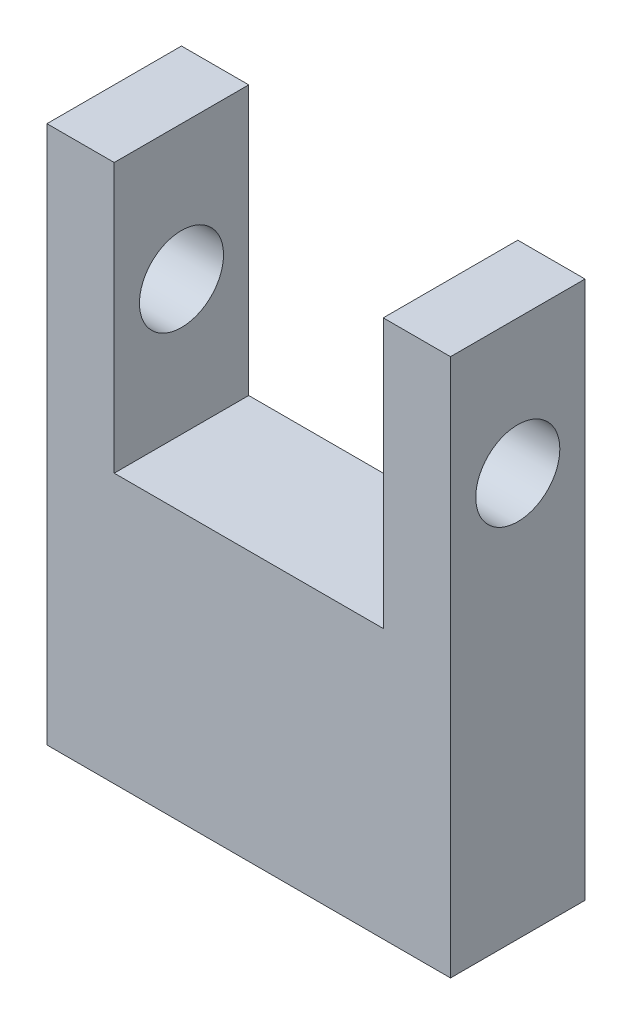
ISO-10303-21;
HEADER;
FILE_DESCRIPTION(('STEP AP214'),'2;1');
FILE_NAME('part.step','',(''),(''),'','','');
FILE_SCHEMA(('AUTOMOTIVE_DESIGN { 1 0 10303 214 1 1 1 1 }'));
ENDSEC;
DATA;
#1=APPLICATION_CONTEXT('core data for automotive mechanical design processes');
#2=APPLICATION_PROTOCOL_DEFINITION('international standard','automotive_design',2000,#1);
#3=PRODUCT_CONTEXT('',#1,'mechanical');
#4=PRODUCT('Part','Part','',(#3));
#5=PRODUCT_RELATED_PRODUCT_CATEGORY('part','',(#4));
#6=PRODUCT_DEFINITION_FORMATION('','',#4);
#7=PRODUCT_DEFINITION_CONTEXT('part definition',#1,'design');
#8=PRODUCT_DEFINITION('design','',#6,#7);
#9=PRODUCT_DEFINITION_SHAPE('','',#8);
#10=(LENGTH_UNIT() NAMED_UNIT(*) SI_UNIT(.MILLI.,.METRE.));
#11=(NAMED_UNIT(*) PLANE_ANGLE_UNIT() SI_UNIT($,.RADIAN.));
#12=(NAMED_UNIT(*) SI_UNIT($,.STERADIAN.) SOLID_ANGLE_UNIT());
#13=UNCERTAINTY_MEASURE_WITH_UNIT(LENGTH_MEASURE(1.E-05),#10,'distance_accuracy_value','');
#14=(GEOMETRIC_REPRESENTATION_CONTEXT(3) GLOBAL_UNCERTAINTY_ASSIGNED_CONTEXT((#13)) GLOBAL_UNIT_ASSIGNED_CONTEXT((#10,
#11,#12)) REPRESENTATION_CONTEXT('',''));
#15=CARTESIAN_POINT('',(0.,0.,0.));
#16=DIRECTION('',(0.,0.,1.));
#17=DIRECTION('',(1.,0.,0.));
#18=AXIS2_PLACEMENT_3D('',#15,#16,#17);
#19=CARTESIAN_POINT('',(38.1,0.,12.7));
#20=DIRECTION('',(-1.,0.,0.));
#21=DIRECTION('',(0.,-1.,0.));
#22=AXIS2_PLACEMENT_3D('',#19,#20,#21);
#23=PLANE('',#22);
#24=CARTESIAN_POINT('',(38.1,76.2,0.));
#25=DIRECTION('',(1.,0.,0.));
#26=DIRECTION('',(0.,0.,-1.));
#27=AXIS2_PLACEMENT_3D('',#24,#25,#26);
#28=CIRCLE('',#27,7.9375);
#29=CARTESIAN_POINT('',(38.1,76.2,-7.9375));
#30=VERTEX_POINT('',#29);
#31=EDGE_CURVE('E185',#30,#30,#28,.T.);
#32=ORIENTED_EDGE('',*,*,#31,.F.);
#33=EDGE_LOOP('',(#32));
#34=FACE_BOUND('',#33,.T.);
#35=DIRECTION('',(0.,1.,0.));
#36=VECTOR('',#35,1.);
#37=CARTESIAN_POINT('',(38.1,0.,-12.7));
#38=LINE('',#37,#36);
#39=CARTESIAN_POINT('',(38.1,0.,-12.7));
#40=VERTEX_POINT('',#39);
#41=CARTESIAN_POINT('',(38.1,101.6,-12.7));
#42=VERTEX_POINT('',#41);
#43=EDGE_CURVE('E129',#40,#42,#38,.T.);
#44=ORIENTED_EDGE('',*,*,#43,.T.);
#45=DIRECTION('',(0.,0.,-1.));
#46=VECTOR('',#45,1.);
#47=CARTESIAN_POINT('',(38.1,101.6,12.7));
#48=LINE('',#47,#46);
#49=CARTESIAN_POINT('',(38.1,101.6,12.7));
#50=VERTEX_POINT('',#49);
#51=EDGE_CURVE('E11',#50,#42,#48,.T.);
#52=ORIENTED_EDGE('',*,*,#51,.F.);
#53=DIRECTION('',(0.,1.,0.));
#54=VECTOR('',#53,1.);
#55=CARTESIAN_POINT('',(38.1,0.,12.7));
#56=LINE('',#55,#54);
#57=CARTESIAN_POINT('',(38.1,0.,12.7));
#58=VERTEX_POINT('',#57);
#59=EDGE_CURVE('E144',#58,#50,#56,.T.);
#60=ORIENTED_EDGE('',*,*,#59,.F.);
#61=DIRECTION('',(0.,0.,-1.));
#62=VECTOR('',#61,1.);
#63=CARTESIAN_POINT('',(38.1,0.,12.7));
#64=LINE('',#63,#62);
#65=EDGE_CURVE('E125',#58,#40,#64,.T.);
#66=ORIENTED_EDGE('',*,*,#65,.T.);
#67=EDGE_LOOP('',(#44,#52,#60,#66));
#68=FACE_BOUND('',#67,.T.);
#69=ADVANCED_FACE('F33',(#34,#68),#23,.F.);
#70=CARTESIAN_POINT('',(38.1,101.6,12.7));
#71=DIRECTION('',(0.,-1.,0.));
#72=DIRECTION('',(1.,0.,0.));
#73=AXIS2_PLACEMENT_3D('',#70,#71,#72);
#74=PLANE('',#73);
#75=DIRECTION('',(-1.,0.,0.));
#76=VECTOR('',#75,1.);
#77=CARTESIAN_POINT('',(38.1,101.6,-12.7));
#78=LINE('',#77,#76);
#79=CARTESIAN_POINT('',(25.4,101.6,-12.7));
#80=VERTEX_POINT('',#79);
#81=EDGE_CURVE('E132',#42,#80,#78,.T.);
#82=ORIENTED_EDGE('',*,*,#81,.T.);
#83=DIRECTION('',(0.,0.,-1.));
#84=VECTOR('',#83,1.);
#85=CARTESIAN_POINT('',(25.4,101.6,12.7));
#86=LINE('',#85,#84);
#87=CARTESIAN_POINT('',(25.4,101.6,12.7));
#88=VERTEX_POINT('',#87);
#89=EDGE_CURVE('E41',#88,#80,#86,.T.);
#90=ORIENTED_EDGE('',*,*,#89,.F.);
#91=DIRECTION('',(-1.,0.,0.));
#92=VECTOR('',#91,1.);
#93=CARTESIAN_POINT('',(38.1,101.6,12.7));
#94=LINE('',#93,#92);
#95=EDGE_CURVE('E92',#50,#88,#94,.T.);
#96=ORIENTED_EDGE('',*,*,#95,.F.);
#97=ORIENTED_EDGE('',*,*,#51,.T.);
#98=EDGE_LOOP('',(#82,#90,#96,#97));
#99=FACE_BOUND('',#98,.T.);
#100=ADVANCED_FACE('F194',(#99),#74,.F.);
#101=CARTESIAN_POINT('',(25.4,101.6,12.7));
#102=DIRECTION('',(1.,0.,0.));
#103=DIRECTION('',(0.,0.,-1.));
#104=AXIS2_PLACEMENT_3D('',#101,#102,#103);
#105=PLANE('',#104);
#106=CARTESIAN_POINT('',(25.4,76.2,0.));
#107=DIRECTION('',(1.,0.,0.));
#108=DIRECTION('',(0.,0.,-1.));
#109=AXIS2_PLACEMENT_3D('',#106,#107,#108);
#110=CIRCLE('',#109,7.9375);
#111=CARTESIAN_POINT('',(25.4,76.2,-7.9375));
#112=VERTEX_POINT('',#111);
#113=EDGE_CURVE('E133',#112,#112,#110,.T.);
#114=ORIENTED_EDGE('',*,*,#113,.T.);
#115=EDGE_LOOP('',(#114));
#116=FACE_BOUND('',#115,.T.);
#117=DIRECTION('',(0.,-1.,0.));
#118=VECTOR('',#117,1.);
#119=CARTESIAN_POINT('',(25.4,101.6,-12.7));
#120=LINE('',#119,#118);
#121=CARTESIAN_POINT('',(25.4,50.8,-12.7));
#122=VERTEX_POINT('',#121);
#123=EDGE_CURVE('E135',#80,#122,#120,.T.);
#124=ORIENTED_EDGE('',*,*,#123,.T.);
#125=DIRECTION('',(0.,0.,-1.));
#126=VECTOR('',#125,1.);
#127=CARTESIAN_POINT('',(25.4,50.8,12.7));
#128=LINE('',#127,#126);
#129=CARTESIAN_POINT('',(25.4,50.8,12.7));
#130=VERTEX_POINT('',#129);
#131=EDGE_CURVE('E151',#130,#122,#128,.T.);
#132=ORIENTED_EDGE('',*,*,#131,.F.);
#133=DIRECTION('',(0.,-1.,0.));
#134=VECTOR('',#133,1.);
#135=CARTESIAN_POINT('',(25.4,101.6,12.7));
#136=LINE('',#135,#134);
#137=EDGE_CURVE('E159',#88,#130,#136,.T.);
#138=ORIENTED_EDGE('',*,*,#137,.F.);
#139=ORIENTED_EDGE('',*,*,#89,.T.);
#140=EDGE_LOOP('',(#124,#132,#138,#139));
#141=FACE_BOUND('',#140,.T.);
#142=ADVANCED_FACE('F157',(#116,#141),#105,.F.);
#143=CARTESIAN_POINT('',(25.4,50.8,12.7));
#144=DIRECTION('',(0.,-1.,0.));
#145=DIRECTION('',(1.,0.,0.));
#146=AXIS2_PLACEMENT_3D('',#143,#144,#145);
#147=PLANE('',#146);
#148=DIRECTION('',(-1.,0.,0.));
#149=VECTOR('',#148,1.);
#150=CARTESIAN_POINT('',(25.4,50.8,-12.7));
#151=LINE('',#150,#149);
#152=CARTESIAN_POINT('',(-25.4,50.8,-12.7));
#153=VERTEX_POINT('',#152);
#154=EDGE_CURVE('E137',#122,#153,#151,.T.);
#155=ORIENTED_EDGE('',*,*,#154,.T.);
#156=DIRECTION('',(0.,0.,-1.));
#157=VECTOR('',#156,1.);
#158=CARTESIAN_POINT('',(-25.4,50.8,12.7));
#159=LINE('',#158,#157);
#160=CARTESIAN_POINT('',(-25.4,50.8,12.7));
#161=VERTEX_POINT('',#160);
#162=EDGE_CURVE('E148',#161,#153,#159,.T.);
#163=ORIENTED_EDGE('',*,*,#162,.F.);
#164=DIRECTION('',(-1.,0.,0.));
#165=VECTOR('',#164,1.);
#166=CARTESIAN_POINT('',(25.4,50.8,12.7));
#167=LINE('',#166,#165);
#168=EDGE_CURVE('E171',#130,#161,#167,.T.);
#169=ORIENTED_EDGE('',*,*,#168,.F.);
#170=ORIENTED_EDGE('',*,*,#131,.T.);
#171=EDGE_LOOP('',(#155,#163,#169,#170));
#172=FACE_BOUND('',#171,.T.);
#173=ADVANCED_FACE('F167',(#172),#147,.F.);
#174=CARTESIAN_POINT('',(-25.4,101.6,12.7));
#175=DIRECTION('',(-1.,0.,0.));
#176=DIRECTION('',(0.,-1.,0.));
#177=AXIS2_PLACEMENT_3D('',#174,#175,#176);
#178=PLANE('',#177);
#179=CARTESIAN_POINT('',(-25.4,76.2,0.));
#180=DIRECTION('',(-1.,0.,0.));
#181=DIRECTION('',(0.,-1.,0.));
#182=AXIS2_PLACEMENT_3D('',#179,#180,#181);
#183=CIRCLE('',#182,7.9375);
#184=CARTESIAN_POINT('',(-25.4,68.2625,0.));
#185=VERTEX_POINT('',#184);
#186=EDGE_CURVE('E179',#185,#185,#183,.T.);
#187=ORIENTED_EDGE('',*,*,#186,.T.);
#188=EDGE_LOOP('',(#187));
#189=FACE_BOUND('',#188,.T.);
#190=DIRECTION('',(0.,1.,0.));
#191=VECTOR('',#190,1.);
#192=CARTESIAN_POINT('',(-25.4,101.6,-12.7));
#193=LINE('',#192,#191);
#194=CARTESIAN_POINT('',(-25.4,101.6,-12.7));
#195=VERTEX_POINT('',#194);
#196=EDGE_CURVE('E139',#153,#195,#193,.T.);
#197=ORIENTED_EDGE('',*,*,#196,.T.);
#198=DIRECTION('',(0.,0.,-1.));
#199=VECTOR('',#198,1.);
#200=CARTESIAN_POINT('',(-25.4,101.6,12.7));
#201=LINE('',#200,#199);
#202=CARTESIAN_POINT('',(-25.4,101.6,12.7));
#203=VERTEX_POINT('',#202);
#204=EDGE_CURVE('E120',#203,#195,#201,.T.);
#205=ORIENTED_EDGE('',*,*,#204,.F.);
#206=DIRECTION('',(0.,1.,0.));
#207=VECTOR('',#206,1.);
#208=CARTESIAN_POINT('',(-25.4,101.6,12.7));
#209=LINE('',#208,#207);
#210=EDGE_CURVE('E111',#161,#203,#209,.T.);
#211=ORIENTED_EDGE('',*,*,#210,.F.);
#212=ORIENTED_EDGE('',*,*,#162,.T.);
#213=EDGE_LOOP('',(#197,#205,#211,#212));
#214=FACE_BOUND('',#213,.T.);
#215=ADVANCED_FACE('F170',(#189,#214),#178,.F.);
#216=CARTESIAN_POINT('',(-38.1,101.6,12.7));
#217=DIRECTION('',(0.,-1.,0.));
#218=DIRECTION('',(1.,0.,0.));
#219=AXIS2_PLACEMENT_3D('',#216,#217,#218);
#220=PLANE('',#219);
#221=DIRECTION('',(-1.,0.,0.));
#222=VECTOR('',#221,1.);
#223=CARTESIAN_POINT('',(-38.1,101.6,-12.7));
#224=LINE('',#223,#222);
#225=CARTESIAN_POINT('',(-38.1,101.6,-12.7));
#226=VERTEX_POINT('',#225);
#227=EDGE_CURVE('E119',#195,#226,#224,.T.);
#228=ORIENTED_EDGE('',*,*,#227,.T.);
#229=DIRECTION('',(0.,0.,-1.));
#230=VECTOR('',#229,1.);
#231=CARTESIAN_POINT('',(-38.1,101.6,12.7));
#232=LINE('',#231,#230);
#233=CARTESIAN_POINT('',(-38.1,101.6,12.7));
#234=VERTEX_POINT('',#233);
#235=EDGE_CURVE('E116',#234,#226,#232,.T.);
#236=ORIENTED_EDGE('',*,*,#235,.F.);
#237=DIRECTION('',(-1.,0.,0.));
#238=VECTOR('',#237,1.);
#239=CARTESIAN_POINT('',(-38.1,101.6,12.7));
#240=LINE('',#239,#238);
#241=EDGE_CURVE('E105',#203,#234,#240,.T.);
#242=ORIENTED_EDGE('',*,*,#241,.F.);
#243=ORIENTED_EDGE('',*,*,#204,.T.);
#244=EDGE_LOOP('',(#228,#236,#242,#243));
#245=FACE_BOUND('',#244,.T.);
#246=ADVANCED_FACE('F117',(#245),#220,.F.);
#247=CARTESIAN_POINT('',(-38.1,0.,12.7));
#248=DIRECTION('',(1.,0.,0.));
#249=DIRECTION('',(0.,1.,0.));
#250=AXIS2_PLACEMENT_3D('',#247,#248,#249);
#251=PLANE('',#250);
#252=CARTESIAN_POINT('',(-38.1,76.2,0.));
#253=DIRECTION('',(1.,0.,0.));
#254=DIRECTION('',(0.,0.,-1.));
#255=AXIS2_PLACEMENT_3D('',#252,#253,#254);
#256=CIRCLE('',#255,7.9375);
#257=CARTESIAN_POINT('',(-38.1,76.2,-7.9375));
#258=VERTEX_POINT('',#257);
#259=EDGE_CURVE('E182',#258,#258,#256,.T.);
#260=ORIENTED_EDGE('',*,*,#259,.T.);
#261=EDGE_LOOP('',(#260));
#262=FACE_BOUND('',#261,.T.);
#263=DIRECTION('',(0.,-1.,0.));
#264=VECTOR('',#263,1.);
#265=CARTESIAN_POINT('',(-38.1,0.,-12.7));
#266=LINE('',#265,#264);
#267=CARTESIAN_POINT('',(-38.1,0.,-12.7));
#268=VERTEX_POINT('',#267);
#269=EDGE_CURVE('E78',#226,#268,#266,.T.);
#270=ORIENTED_EDGE('',*,*,#269,.T.);
#271=DIRECTION('',(0.,0.,-1.));
#272=VECTOR('',#271,1.);
#273=CARTESIAN_POINT('',(-38.1,0.,12.7));
#274=LINE('',#273,#272);
#275=CARTESIAN_POINT('',(-38.1,0.,12.7));
#276=VERTEX_POINT('',#275);
#277=EDGE_CURVE('E121',#276,#268,#274,.T.);
#278=ORIENTED_EDGE('',*,*,#277,.F.);
#279=DIRECTION('',(0.,-1.,0.));
#280=VECTOR('',#279,1.);
#281=CARTESIAN_POINT('',(-38.1,0.,12.7));
#282=LINE('',#281,#280);
#283=EDGE_CURVE('E109',#234,#276,#282,.T.);
#284=ORIENTED_EDGE('',*,*,#283,.F.);
#285=ORIENTED_EDGE('',*,*,#235,.T.);
#286=EDGE_LOOP('',(#270,#278,#284,#285));
#287=FACE_BOUND('',#286,.T.);
#288=ADVANCED_FACE('F123',(#262,#287),#251,.F.);
#289=CARTESIAN_POINT('',(-38.1,0.,12.7));
#290=DIRECTION('',(0.,1.,0.));
#291=DIRECTION('',(-1.,0.,0.));
#292=AXIS2_PLACEMENT_3D('',#289,#290,#291);
#293=PLANE('',#292);
#294=DIRECTION('',(1.,0.,0.));
#295=VECTOR('',#294,1.);
#296=CARTESIAN_POINT('',(-38.1,0.,-12.7));
#297=LINE('',#296,#295);
#298=EDGE_CURVE('E84',#268,#40,#297,.T.);
#299=ORIENTED_EDGE('',*,*,#298,.T.);
#300=ORIENTED_EDGE('',*,*,#65,.F.);
#301=DIRECTION('',(1.,0.,0.));
#302=VECTOR('',#301,1.);
#303=CARTESIAN_POINT('',(-38.1,0.,12.7));
#304=LINE('',#303,#302);
#305=EDGE_CURVE('E49',#276,#58,#304,.T.);
#306=ORIENTED_EDGE('',*,*,#305,.F.);
#307=ORIENTED_EDGE('',*,*,#277,.T.);
#308=EDGE_LOOP('',(#299,#300,#306,#307));
#309=FACE_BOUND('',#308,.T.);
#310=ADVANCED_FACE('F197',(#309),#293,.F.);
#311=CARTESIAN_POINT('',(0.,0.,12.7));
#312=DIRECTION('',(0.,0.,1.));
#313=DIRECTION('',(1.,0.,0.));
#314=AXIS2_PLACEMENT_3D('',#311,#312,#313);
#315=PLANE('',#314);
#316=ORIENTED_EDGE('',*,*,#59,.T.);
#317=ORIENTED_EDGE('',*,*,#95,.T.);
#318=ORIENTED_EDGE('',*,*,#137,.T.);
#319=ORIENTED_EDGE('',*,*,#168,.T.);
#320=ORIENTED_EDGE('',*,*,#210,.T.);
#321=ORIENTED_EDGE('',*,*,#241,.T.);
#322=ORIENTED_EDGE('',*,*,#283,.T.);
#323=ORIENTED_EDGE('',*,*,#305,.T.);
#324=EDGE_LOOP('',(#316,#317,#318,#319,#320,#321,#322,#323));
#325=FACE_BOUND('',#324,.T.);
#326=ADVANCED_FACE('F107',(#325),#315,.T.);
#327=CARTESIAN_POINT('',(0.,0.,-12.7));
#328=DIRECTION('',(0.,0.,1.));
#329=DIRECTION('',(1.,0.,0.));
#330=AXIS2_PLACEMENT_3D('',#327,#328,#329);
#331=PLANE('',#330);
#332=ORIENTED_EDGE('',*,*,#43,.F.);
#333=ORIENTED_EDGE('',*,*,#298,.F.);
#334=ORIENTED_EDGE('',*,*,#269,.F.);
#335=ORIENTED_EDGE('',*,*,#227,.F.);
#336=ORIENTED_EDGE('',*,*,#196,.F.);
#337=ORIENTED_EDGE('',*,*,#154,.F.);
#338=ORIENTED_EDGE('',*,*,#123,.F.);
#339=ORIENTED_EDGE('',*,*,#81,.F.);
#340=EDGE_LOOP('',(#332,#333,#334,#335,#336,#337,#338,#339));
#341=FACE_BOUND('',#340,.T.);
#342=ADVANCED_FACE('F163',(#341),#331,.F.);
#343=CARTESIAN_POINT('',(-38.1,76.2,0.));
#344=DIRECTION('',(1.,0.,0.));
#345=DIRECTION('',(0.,0.,-1.));
#346=AXIS2_PLACEMENT_3D('',#343,#344,#345);
#347=CYLINDRICAL_SURFACE('',#346,7.9375);
#348=ORIENTED_EDGE('',*,*,#259,.F.);
#349=EDGE_LOOP('',(#348));
#350=FACE_BOUND('',#349,.T.);
#351=ORIENTED_EDGE('',*,*,#186,.F.);
#352=EDGE_LOOP('',(#351));
#353=FACE_BOUND('',#352,.T.);
#354=ADVANCED_FACE('F249',(#350,#353),#347,.F.);
#355=ORIENTED_EDGE('',*,*,#31,.T.);
#356=EDGE_LOOP('',(#355));
#357=FACE_BOUND('',#356,.T.);
#358=ORIENTED_EDGE('',*,*,#113,.F.);
#359=EDGE_LOOP('',(#358));
#360=FACE_BOUND('',#359,.T.);
#361=ADVANCED_FACE('F189',(#357,#360),#347,.F.);
#362=CLOSED_SHELL('',(#69,#100,#142,#173,#215,#246,#288,#310,#326,#342,#354,#361));
#363=MANIFOLD_SOLID_BREP('B2',#362);
#364=ADVANCED_BREP_SHAPE_REPRESENTATION('',(#18,#363),#14);
#365=SHAPE_DEFINITION_REPRESENTATION(#9,#364);
ENDSEC;
END-ISO-10303-21;
